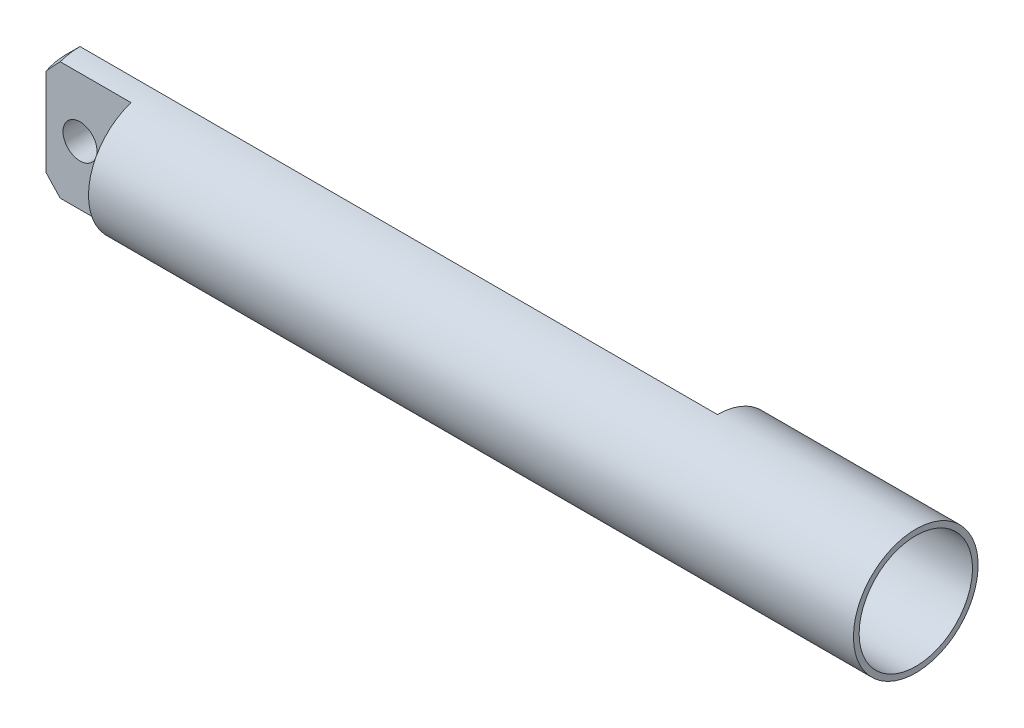
ISO-10303-21;
HEADER;
FILE_DESCRIPTION(('STEP AP214'),'2;1');
FILE_NAME('part.step','',(''),(''),'','','');
FILE_SCHEMA(('AUTOMOTIVE_DESIGN { 1 0 10303 214 1 1 1 1 }'));
ENDSEC;
DATA;
#1=APPLICATION_CONTEXT('core data for automotive mechanical design processes');
#2=APPLICATION_PROTOCOL_DEFINITION('international standard','automotive_design',2000,#1);
#3=PRODUCT_CONTEXT('',#1,'mechanical');
#4=PRODUCT('Part','Part','',(#3));
#5=PRODUCT_RELATED_PRODUCT_CATEGORY('part','',(#4));
#6=PRODUCT_DEFINITION_FORMATION('','',#4);
#7=PRODUCT_DEFINITION_CONTEXT('part definition',#1,'design');
#8=PRODUCT_DEFINITION('design','',#6,#7);
#9=PRODUCT_DEFINITION_SHAPE('','',#8);
#10=(LENGTH_UNIT() NAMED_UNIT(*) SI_UNIT(.MILLI.,.METRE.));
#11=(NAMED_UNIT(*) PLANE_ANGLE_UNIT() SI_UNIT($,.RADIAN.));
#12=(NAMED_UNIT(*) SI_UNIT($,.STERADIAN.) SOLID_ANGLE_UNIT());
#13=UNCERTAINTY_MEASURE_WITH_UNIT(LENGTH_MEASURE(1.E-05),#10,'distance_accuracy_value','');
#14=(GEOMETRIC_REPRESENTATION_CONTEXT(3) GLOBAL_UNCERTAINTY_ASSIGNED_CONTEXT((#13)) GLOBAL_UNIT_ASSIGNED_CONTEXT((#10,
#11,#12)) REPRESENTATION_CONTEXT('',''));
#15=CARTESIAN_POINT('',(0.,0.,0.));
#16=DIRECTION('',(0.,0.,1.));
#17=DIRECTION('',(1.,0.,0.));
#18=AXIS2_PLACEMENT_3D('',#15,#16,#17);
#19=CARTESIAN_POINT('',(0.,0.,0.));
#20=DIRECTION('',(1.,0.,0.));
#21=DIRECTION('',(0.,0.,-1.));
#22=AXIS2_PLACEMENT_3D('',#19,#20,#21);
#23=CONICAL_SURFACE('',#22,17.,0.785398163397446);
#24=CARTESIAN_POINT('',(5.00000000000003,0.,0.));
#25=DIRECTION('',(1.,0.,0.));
#26=DIRECTION('',(0.,0.,-1.));
#27=AXIS2_PLACEMENT_3D('',#24,#25,#26);
#28=CIRCLE('',#27,22.);
#29=CARTESIAN_POINT('',(5.00000000000003,22.,0.));
#30=VERTEX_POINT('',#29);
#31=CARTESIAN_POINT('',(5.00000000000003,20.8566536146142,7.));
#32=VERTEX_POINT('',#31);
#33=EDGE_CURVE('E218',#30,#32,#28,.T.);
#34=ORIENTED_EDGE('',*,*,#33,.F.);
#35=DIRECTION('',(0.707106781186549,0.707106781186546,0.));
#36=VECTOR('',#35,1.);
#37=CARTESIAN_POINT('',(-17.0000000000001,0.,0.));
#38=LINE('',#37,#36);
#39=CARTESIAN_POINT('',(0.,17.,0.));
#40=VERTEX_POINT('',#39);
#41=EDGE_CURVE('E175',#30,#40,#38,.F.);
#42=ORIENTED_EDGE('',*,*,#41,.T.);
#43=CARTESIAN_POINT('',(0.,0.,0.));
#44=DIRECTION('',(1.,0.,0.));
#45=DIRECTION('',(0.,0.,-1.));
#46=AXIS2_PLACEMENT_3D('',#43,#44,#45);
#47=CIRCLE('',#46,17.);
#48=CARTESIAN_POINT('',(0.,15.4919333848297,7.));
#49=VERTEX_POINT('',#48);
#50=EDGE_CURVE('E154',#49,#40,#47,.F.);
#51=ORIENTED_EDGE('',*,*,#50,.F.);
#52=CARTESIAN_POINT('',(31.5701077905815,48.0630353888379,7.));
#53=CARTESIAN_POINT('',(30.8650761382699,47.3505632230193,7.));
#54=CARTESIAN_POINT('',(30.1602065255339,46.6379306918936,7.));
#55=CARTESIAN_POINT('',(28.7508440464437,45.2122915091911,7.));
#56=CARTESIAN_POINT('',(28.0463511805407,44.4992848571683,7.));
#57=CARTESIAN_POINT('',(25.9328341762823,42.3589324364409,7.));
#58=CARTESIAN_POINT('',(24.5244575258011,40.9309471282378,7.));
#59=CARTESIAN_POINT('',(21.6970223543506,38.0594690326153,7.));
#60=CARTESIAN_POINT('',(20.2779854635847,36.6159549356621,7.));
#61=CARTESIAN_POINT('',(18.1522875392003,34.4485560927306,7.));
#62=CARTESIAN_POINT('',(17.444366089254,33.7259075862687,7.));
#63=CARTESIAN_POINT('',(16.0295523010908,32.2796199318595,7.));
#64=CARTESIAN_POINT('',(15.3226599512197,31.5559807953135,7.));
#65=CARTESIAN_POINT('',(13.6596415445129,29.8506444878507,7.));
#66=CARTESIAN_POINT('',(12.7040333637323,28.8684419762615,7.));
#67=CARTESIAN_POINT('',(10.7958232811266,26.9010256039762,7.));
#68=CARTESIAN_POINT('',(9.84322153031176,25.9158115967585,7.));
#69=CARTESIAN_POINT('',(7.94065271163517,23.9396758972288,7.));
#70=CARTESIAN_POINT('',(6.99069266344639,22.9487474361605,7.));
#71=CARTESIAN_POINT('',(5.57045220865292,21.4580484351075,7.));
#72=CARTESIAN_POINT('',(5.09786459650827,20.9604763244431,7.));
#73=CARTESIAN_POINT('',(4.15458893420663,19.9635354098252,7.));
#74=CARTESIAN_POINT('',(3.68390088073946,19.4641666090057,7.));
#75=CARTESIAN_POINT('',(2.74823564369237,18.4667925844649,7.));
#76=CARTESIAN_POINT('',(2.28324168477367,17.9688031096764,7.));
#77=CARTESIAN_POINT('',(1.35619003741677,16.9700981376442,7.));
#78=CARTESIAN_POINT('',(0.894132344076689,16.4693826449539,7.));
#79=CARTESIAN_POINT('',(-0.0265449003242374,15.4641209887141,7.));
#80=CARTESIAN_POINT('',(-0.485161691456694,14.9595722927023,7.));
#81=CARTESIAN_POINT('',(-1.16932139972602,14.1993848119594,7.));
#82=CARTESIAN_POINT('',(-1.39674089251136,13.9454352315961,7.));
#83=CARTESIAN_POINT('',(-1.85012285545061,13.436226320162,7.));
#84=CARTESIAN_POINT('',(-2.07608528145381,13.1809669498199,7.));
#85=CARTESIAN_POINT('',(-2.75006025917463,12.4145182758588,7.));
#86=CARTESIAN_POINT('',(-3.1955616171932,11.9011068563673,7.));
#87=CARTESIAN_POINT('',(-3.85670055654037,11.1249500019967,7.));
#88=CARTESIAN_POINT('',(-4.07589068401354,10.8652293067926,7.));
#89=CARTESIAN_POINT('',(-4.51140108065928,10.3433948789674,7.));
#90=CARTESIAN_POINT('',(-4.72772139027854,10.0812811801608,7.));
#91=CARTESIAN_POINT('',(-5.15663585066014,9.55450822884358,7.));
#92=CARTESIAN_POINT('',(-5.36923391735207,9.28985216967131,7.));
#93=CARTESIAN_POINT('',(-5.79015046559175,8.75713433134795,7.));
#94=CARTESIAN_POINT('',(-5.99846879309546,8.48907243016777,7.));
#95=CARTESIAN_POINT('',(-6.40966208162001,7.94895702349721,7.));
#96=CARTESIAN_POINT('',(-6.61253906199983,7.67690505841673,7.));
#97=CARTESIAN_POINT('',(-7.0114712487723,7.12785619638195,7.));
#98=CARTESIAN_POINT('',(-7.2075271968475,6.85085984204108,7.));
#99=CARTESIAN_POINT('',(-7.44964218217866,6.49709216248077,7.));
#100=CARTESIAN_POINT('',(-7.49981370126489,6.42312658187934,7.));
#101=CARTESIAN_POINT('',(-7.59949789401569,6.27474812910039,7.));
#102=CARTESIAN_POINT('',(-7.64901054010798,6.20033523839199,7.));
#103=CARTESIAN_POINT('',(-7.79649371009593,5.97638328025984,7.));
#104=CARTESIAN_POINT('',(-7.89340188161102,5.82614198033318,7.));
#105=CARTESIAN_POINT('',(-8.08395810085896,5.52355198936783,7.));
#106=CARTESIAN_POINT('',(-8.17760539709554,5.3712028237104,7.));
#107=CARTESIAN_POINT('',(-8.36106543411646,5.06421841160476,7.));
#108=CARTESIAN_POINT('',(-8.45087822101401,4.9095831926784,7.));
#109=CARTESIAN_POINT('',(-8.71225392812507,4.44436993971348,7.));
#110=CARTESIAN_POINT('',(-8.87729850653726,4.1300686287095,7.));
#111=CARTESIAN_POINT('',(-9.18332554692453,3.48988581256848,7.));
#112=CARTESIAN_POINT('',(-9.32431998495111,3.16401016926225,7.));
#113=CARTESIAN_POINT('',(-9.52601934968783,2.62615608190444,7.));
#114=CARTESIAN_POINT('',(-9.59686672285746,2.41799279992795,7.));
#115=CARTESIAN_POINT('',(-9.72345196152338,1.99709989936599,7.));
#116=CARTESIAN_POINT('',(-9.77919271681168,1.78437116253491,7.));
#117=CARTESIAN_POINT('',(-9.8729675183327,1.35577322277707,7.));
#118=CARTESIAN_POINT('',(-9.91106289065166,1.13991762688148,7.));
#119=CARTESIAN_POINT('',(-9.96781604509921,0.70563381251934,7.));
#120=CARTESIAN_POINT('',(-9.98647476535196,0.487205718730935,7.));
#121=CARTESIAN_POINT('',(-10.0032942419288,0.0481206090549654,7.));
#122=CARTESIAN_POINT('',(-10.0013206685666,-0.172541657224552,7.));
#123=CARTESIAN_POINT('',(-9.97667563599004,-0.612689287418194,7.));
#124=CARTESIAN_POINT('',(-9.95400376845756,-0.832174628029023,7.));
#125=CARTESIAN_POINT('',(-9.88922372520413,-1.2688271219645,7.));
#126=CARTESIAN_POINT('',(-9.84706253684897,-1.48598628888818,7.));
#127=CARTESIAN_POINT('',(-9.74547883615067,-1.91619890720227,7.));
#128=CARTESIAN_POINT('',(-9.68605315416654,-2.12925159700607,7.));
#129=CARTESIAN_POINT('',(-9.51128167766772,-2.68054257011638,7.));
#130=CARTESIAN_POINT('',(-9.38404477100819,-3.01500150331893,7.));
#131=CARTESIAN_POINT('',(-9.10108796968404,-3.67163491265435,7.));
#132=CARTESIAN_POINT('',(-8.94534323992436,-3.99379837931033,7.));
#133=CARTESIAN_POINT('',(-8.6958592968862,-4.46956269651672,7.));
#134=CARTESIAN_POINT('',(-8.60982101541379,-4.62728453460318,7.));
#135=CARTESIAN_POINT('',(-8.43326546216344,-4.94020814683483,7.));
#136=CARTESIAN_POINT('',(-8.34274813476996,-5.09540988965665,7.));
#137=CARTESIAN_POINT('',(-8.15794167106159,-5.40344039395045,7.));
#138=CARTESIAN_POINT('',(-8.06365437496583,-5.55627026382095,7.));
#139=CARTESIAN_POINT('',(-7.87180313392317,-5.85984533770355,7.));
#140=CARTESIAN_POINT('',(-7.77423932260608,-6.01059062638032,7.));
#141=CARTESIAN_POINT('',(-7.43851477249205,-6.51879212358237,7.));
#142=CARTESIAN_POINT('',(-7.19370875988075,-6.87186408827454,7.));
#143=CARTESIAN_POINT('',(-6.69259025979986,-7.56977595354441,7.));
#144=CARTESIAN_POINT('',(-6.43627517115237,-7.91461396590771,7.));
#145=CARTESIAN_POINT('',(-5.91497265284755,-8.59806209694107,7.));
#146=CARTESIAN_POINT('',(-5.64997882955784,-8.9366673234023,7.));
#147=CARTESIAN_POINT('',(-5.11360283988082,-9.60871314837262,7.));
#148=CARTESIAN_POINT('',(-4.8422212150803,-9.94215418077952,7.));
#149=CARTESIAN_POINT('',(-4.29383966381738,-10.6057281600215,7.));
#150=CARTESIAN_POINT('',(-4.0168277750113,-10.9358511994809,7.));
#151=CARTESIAN_POINT('',(-3.45887319379346,-11.5927625860197,7.));
#152=CARTESIAN_POINT('',(-3.17793043120126,-11.919550873381,7.));
#153=CARTESIAN_POINT('',(-2.61301938729385,-12.5702533767026,7.));
#154=CARTESIAN_POINT('',(-2.32905245082897,-12.8941687616829,7.));
#155=CARTESIAN_POINT('',(-1.75855432118312,-13.5397350102771,7.));
#156=CARTESIAN_POINT('',(-1.47202310906609,-13.8613858571369,7.));
#157=CARTESIAN_POINT('',(-0.607709955294125,-14.8252699109725,7.));
#158=CARTESIAN_POINT('',(-0.0267581145560945,-15.4646602646406,7.));
#159=CARTESIAN_POINT('',(1.14109612470462,-16.7380839327859,7.));
#160=CARTESIAN_POINT('',(1.72799911235955,-17.3721167052725,7.));
#161=CARTESIAN_POINT('',(2.90527627308781,-18.6352431982205,7.));
#162=CARTESIAN_POINT('',(3.49564423283112,-19.2643427148722,7.));
#163=CARTESIAN_POINT('',(4.67960046676606,-20.5194638586059,7.));
#164=CARTESIAN_POINT('',(5.27318864004685,-21.1454855809772,7.));
#165=CARTESIAN_POINT('',(6.39950269375031,-22.3285889800581,7.));
#166=CARTESIAN_POINT('',(6.93197638181449,-22.885910900628,7.));
#167=CARTESIAN_POINT('',(7.99854022023005,-23.9990062363673,7.));
#168=CARTESIAN_POINT('',(8.5326303720933,-24.5547796500874,7.));
#169=CARTESIAN_POINT('',(10.136882535791,-26.2202171075156,7.));
#170=CARTESIAN_POINT('',(11.2090131772108,-27.3279846610412,7.));
#171=CARTESIAN_POINT('',(13.3575190899308,-29.5406244420544,7.));
#172=CARTESIAN_POINT('',(14.433896440103,-30.6454946485879,7.));
#173=CARTESIAN_POINT('',(16.5892870464237,-32.852650133153,7.));
#174=CARTESIAN_POINT('',(17.6683002902857,-33.9549354231867,7.));
#175=CARTESIAN_POINT('',(19.8142771125641,-36.1432734152895,7.));
#176=CARTESIAN_POINT('',(20.8812152579,-37.2293510678509,7.));
#177=CARTESIAN_POINT('',(23.0165730701089,-39.4000520773872,7.));
#178=CARTESIAN_POINT('',(24.0849927393276,-40.4846754320543,7.));
#179=CARTESIAN_POINT('',(26.2223342961586,-42.6521118030097,7.));
#180=CARTESIAN_POINT('',(27.2912554709257,-43.7349255223925,7.));
#181=CARTESIAN_POINT('',(29.4300338889634,-45.8996233029592,7.));
#182=CARTESIAN_POINT('',(30.4998911301015,-46.9815073662501,7.));
#183=CARTESIAN_POINT('',(31.5701077905815,-48.063035388838,7.));
#184=B_SPLINE_CURVE_WITH_KNOTS('',3,(#52,#53,#54,#55,#56,#57,#58,#59,#60,#61,#62,#63,#64,#65,
#66,#67,#68,#69,#70,#71,#72,#73,#74,#75,#76,#77,#78,#79,#80,#81,#82,#83,#84,#85,#86,#87,#88,#89,
#90,#91,#92,#93,#94,#95,#96,#97,#98,#99,#100,#101,#102,#103,#104,#105,#106,#107,#108,#109,#110,
#111,#112,#113,#114,#115,#116,#117,#118,#119,#120,#121,#122,#123,#124,#125,#126,#127,#128,#129,
#130,#131,#132,#133,#134,#135,#136,#137,#138,#139,#140,#141,#142,#143,#144,#145,#146,#147,#148,
#149,#150,#151,#152,#153,#154,#155,#156,#157,#158,#159,#160,#161,#162,#163,#164,#165,#166,#167,
#168,#169,#170,#171,#172,#173,#174,#175,#176,#177,#178,#179,#180,#181,#182,#183),.UNSPECIFIED.,
.F.,.F.,(4,2,2,2,2,2,2,2,2,2,2,2,2,2,2,2,2,2,2,2,2,2,2,2,2,2,2,2,2,2,2,2,2,2,2,2,2,2,2,2,2,2,2,
2,2,2,2,2,2,2,2,2,2,2,2,2,2,2,2,2,2,2,2,2,2,4),(0.,3.00702108879685,6.01404577192607,
12.0310200924749,18.1036253005166,21.1384824197541,24.1733048989162,28.2844040383324,
32.3957064887369,36.5138486628209,38.5725467512036,40.6312412505342,42.6752269475995,
44.7192092314881,46.7646855376217,47.7873677956584,48.8100808978194,50.8492357746153,
51.8687753633788,52.8883005676398,53.9066795042937,54.9250950322714,55.9431272306233,
56.9610483854246,57.2291740040194,57.4973108079836,58.0336246251177,58.570061233115,
59.1064913881901,60.1707614932866,61.2345000754959,61.8937028842191,62.552779502833,
63.2095480048328,63.8662848059533,64.5273000408138,65.1883283158954,65.8511653221205,
66.5141240975964,67.5857046277632,68.6582231661447,69.1971535531769,69.7360906336943,
70.2747677820411,70.8134229875261,72.1019674855226,73.3908046892271,74.6806137394121,
75.9703138248588,77.2631216232246,78.5559525324529,79.848230718051,81.1405184544466,
83.7321606327217,86.3240619245699,88.9122319728333,91.5003213795792,93.8127239749873,
96.1251287338571,100.749995086049,105.377509509904,110.005002404787,114.572417353221,
119.139839541231,123.704453071571,128.269056229705),.UNSPECIFIED.);
#185=EDGE_CURVE('E276',#32,#49,#184,.T.);
#186=ORIENTED_EDGE('',*,*,#185,.F.);
#187=EDGE_LOOP('',(#34,#42,#51,#186));
#188=FACE_BOUND('',#187,.T.);
#189=ADVANCED_FACE('F39',(#188),#23,.T.);
#190=CARTESIAN_POINT('',(0.,0.,0.));
#191=DIRECTION('',(1.,0.,0.));
#192=DIRECTION('',(0.,0.,-1.));
#193=AXIS2_PLACEMENT_3D('',#190,#191,#192);
#194=PLANE('',#193);
#195=DIRECTION('',(0.,-1.,0.));
#196=VECTOR('',#195,1.);
#197=CARTESIAN_POINT('',(0.,28.1356099975247,0.));
#198=LINE('',#197,#196);
#199=CARTESIAN_POINT('',(0.,0.,0.));
#200=VERTEX_POINT('',#199);
#201=EDGE_CURVE('E134',#40,#200,#198,.T.);
#202=ORIENTED_EDGE('',*,*,#201,.T.);
#203=DIRECTION('',(0.,0.,-1.));
#204=VECTOR('',#203,1.);
#205=CARTESIAN_POINT('',(0.,0.,-39.2357516968204));
#206=LINE('',#205,#204);
#207=CARTESIAN_POINT('',(0.,0.,-7.));
#208=VERTEX_POINT('',#207);
#209=EDGE_CURVE('E142',#200,#208,#206,.T.);
#210=ORIENTED_EDGE('',*,*,#209,.T.);
#211=DIRECTION('',(0.,-1.,0.));
#212=VECTOR('',#211,1.);
#213=CARTESIAN_POINT('',(0.,0.,-7.));
#214=LINE('',#213,#212);
#215=CARTESIAN_POINT('',(0.,-15.4919333848297,-7.));
#216=VERTEX_POINT('',#215);
#217=EDGE_CURVE('E199',#208,#216,#214,.T.);
#218=ORIENTED_EDGE('',*,*,#217,.T.);
#219=CARTESIAN_POINT('',(0.,-15.4919333848297,7.));
#220=VERTEX_POINT('',#219);
#221=EDGE_CURVE('E214',#216,#220,#47,.F.);
#222=ORIENTED_EDGE('',*,*,#221,.T.);
#223=DIRECTION('',(0.,1.,0.));
#224=VECTOR('',#223,1.);
#225=CARTESIAN_POINT('',(0.,0.,7.));
#226=LINE('',#225,#224);
#227=EDGE_CURVE('E191',#220,#49,#226,.T.);
#228=ORIENTED_EDGE('',*,*,#227,.T.);
#229=ORIENTED_EDGE('',*,*,#50,.T.);
#230=EDGE_LOOP('',(#202,#210,#218,#222,#228,#229));
#231=FACE_BOUND('',#230,.T.);
#232=ADVANCED_FACE('F151',(#231),#194,.F.);
#233=CARTESIAN_POINT('',(0.,0.,0.));
#234=DIRECTION('',(-1.,0.,0.));
#235=DIRECTION('',(0.,0.,1.));
#236=AXIS2_PLACEMENT_3D('',#233,#234,#235);
#237=CYLINDRICAL_SURFACE('',#236,22.);
#238=CARTESIAN_POINT('',(300.,0.,0.));
#239=DIRECTION('',(-1.,0.,0.));
#240=DIRECTION('',(0.,0.,1.));
#241=AXIS2_PLACEMENT_3D('',#238,#239,#240);
#242=CIRCLE('',#241,22.);
#243=CARTESIAN_POINT('',(300.,0.,22.));
#244=VERTEX_POINT('',#243);
#245=EDGE_CURVE('E211',#244,#244,#242,.T.);
#246=ORIENTED_EDGE('',*,*,#245,.T.);
#247=EDGE_LOOP('',(#246));
#248=FACE_BOUND('',#247,.T.);
#249=DIRECTION('',(-1.,0.,0.));
#250=VECTOR('',#249,1.);
#251=CARTESIAN_POINT('',(0.,22.,0.));
#252=LINE('',#251,#250);
#253=CARTESIAN_POINT('',(230.,22.,0.));
#254=VERTEX_POINT('',#253);
#255=EDGE_CURVE('E173',#30,#254,#252,.F.);
#256=ORIENTED_EDGE('',*,*,#255,.F.);
#257=ORIENTED_EDGE('',*,*,#33,.T.);
#258=DIRECTION('',(-1.,0.,0.));
#259=VECTOR('',#258,1.);
#260=CARTESIAN_POINT('',(0.,20.8566536146142,7.));
#261=LINE('',#260,#259);
#262=CARTESIAN_POINT('',(30.,20.8566536146142,7.));
#263=VERTEX_POINT('',#262);
#264=EDGE_CURVE('E193',#32,#263,#261,.F.);
#265=ORIENTED_EDGE('',*,*,#264,.T.);
#266=CARTESIAN_POINT('',(30.,0.,0.));
#267=DIRECTION('',(1.,0.,0.));
#268=DIRECTION('',(0.,0.,-1.));
#269=AXIS2_PLACEMENT_3D('',#266,#267,#268);
#270=CIRCLE('',#269,22.);
#271=CARTESIAN_POINT('',(30.,-20.8566536146142,7.));
#272=VERTEX_POINT('',#271);
#273=EDGE_CURVE('E285',#263,#272,#270,.T.);
#274=ORIENTED_EDGE('',*,*,#273,.T.);
#275=DIRECTION('',(-1.,0.,0.));
#276=VECTOR('',#275,1.);
#277=CARTESIAN_POINT('',(0.,-20.8566536146142,7.));
#278=LINE('',#277,#276);
#279=CARTESIAN_POINT('',(5.00000000000003,-20.8566536146142,7.));
#280=VERTEX_POINT('',#279);
#281=EDGE_CURVE('E188',#272,#280,#278,.T.);
#282=ORIENTED_EDGE('',*,*,#281,.T.);
#283=CARTESIAN_POINT('',(5.00000000000003,-20.8566536146142,-7.));
#284=VERTEX_POINT('',#283);
#285=EDGE_CURVE('E217',#280,#284,#28,.T.);
#286=ORIENTED_EDGE('',*,*,#285,.T.);
#287=DIRECTION('',(-1.,0.,0.));
#288=VECTOR('',#287,1.);
#289=CARTESIAN_POINT('',(0.,-20.8566536146142,-7.));
#290=LINE('',#289,#288);
#291=CARTESIAN_POINT('',(30.,-20.8566536146142,-7.));
#292=VERTEX_POINT('',#291);
#293=EDGE_CURVE('E201',#284,#292,#290,.F.);
#294=ORIENTED_EDGE('',*,*,#293,.T.);
#295=CARTESIAN_POINT('',(30.,0.,0.));
#296=DIRECTION('',(1.,0.,0.));
#297=DIRECTION('',(0.,0.,-1.));
#298=AXIS2_PLACEMENT_3D('',#295,#296,#297);
#299=CIRCLE('',#298,22.);
#300=CARTESIAN_POINT('',(30.,0.,-22.));
#301=VERTEX_POINT('',#300);
#302=EDGE_CURVE('E227',#292,#301,#299,.T.);
#303=ORIENTED_EDGE('',*,*,#302,.T.);
#304=DIRECTION('',(-1.,0.,0.));
#305=VECTOR('',#304,1.);
#306=CARTESIAN_POINT('',(0.,0.,-22.));
#307=LINE('',#306,#305);
#308=CARTESIAN_POINT('',(230.,0.,-22.));
#309=VERTEX_POINT('',#308);
#310=EDGE_CURVE('E163',#309,#301,#307,.T.);
#311=ORIENTED_EDGE('',*,*,#310,.F.);
#312=CARTESIAN_POINT('',(230.,0.,0.));
#313=DIRECTION('',(-1.,0.,0.));
#314=DIRECTION('',(0.,0.,1.));
#315=AXIS2_PLACEMENT_3D('',#312,#313,#314);
#316=CIRCLE('',#315,22.);
#317=EDGE_CURVE('E177',#254,#309,#316,.T.);
#318=ORIENTED_EDGE('',*,*,#317,.F.);
#319=EDGE_LOOP('',(#256,#257,#265,#274,#282,#286,#294,#303,#311,#318));
#320=FACE_BOUND('',#319,.T.);
#321=ADVANCED_FACE('F245',(#248,#320),#237,.T.);
#322=CARTESIAN_POINT('',(0.,0.,0.));
#323=DIRECTION('',(-1.,0.,0.));
#324=DIRECTION('',(0.,0.,1.));
#325=AXIS2_PLACEMENT_3D('',#322,#323,#324);
#326=CYLINDRICAL_SURFACE('',#325,20.);
#327=CARTESIAN_POINT('',(300.,0.,0.));
#328=DIRECTION('',(-1.,0.,0.));
#329=DIRECTION('',(0.,0.,1.));
#330=AXIS2_PLACEMENT_3D('',#327,#328,#329);
#331=CIRCLE('',#330,20.);
#332=CARTESIAN_POINT('',(300.,0.,20.));
#333=VERTEX_POINT('',#332);
#334=EDGE_CURVE('E208',#333,#333,#331,.T.);
#335=ORIENTED_EDGE('',*,*,#334,.F.);
#336=EDGE_LOOP('',(#335));
#337=FACE_BOUND('',#336,.T.);
#338=DIRECTION('',(-1.,0.,0.));
#339=VECTOR('',#338,1.);
#340=CARTESIAN_POINT('',(0.,20.,0.));
#341=LINE('',#340,#339);
#342=CARTESIAN_POINT('',(230.,20.,0.));
#343=VERTEX_POINT('',#342);
#344=CARTESIAN_POINT('',(40.,20.,0.));
#345=VERTEX_POINT('',#344);
#346=EDGE_CURVE('E171',#343,#345,#341,.T.);
#347=ORIENTED_EDGE('',*,*,#346,.F.);
#348=CARTESIAN_POINT('',(230.,0.,0.));
#349=DIRECTION('',(-1.,0.,0.));
#350=DIRECTION('',(0.,0.,1.));
#351=AXIS2_PLACEMENT_3D('',#348,#349,#350);
#352=CIRCLE('',#351,20.);
#353=CARTESIAN_POINT('',(230.,0.,-20.));
#354=VERTEX_POINT('',#353);
#355=EDGE_CURVE('E12',#354,#343,#352,.F.);
#356=ORIENTED_EDGE('',*,*,#355,.F.);
#357=DIRECTION('',(-1.,0.,0.));
#358=VECTOR('',#357,1.);
#359=CARTESIAN_POINT('',(0.,0.,-20.));
#360=LINE('',#359,#358);
#361=CARTESIAN_POINT('',(40.,0.,-20.));
#362=VERTEX_POINT('',#361);
#363=EDGE_CURVE('E167',#362,#354,#360,.F.);
#364=ORIENTED_EDGE('',*,*,#363,.F.);
#365=CARTESIAN_POINT('',(40.,0.,0.));
#366=DIRECTION('',(-1.,0.,0.));
#367=DIRECTION('',(0.,0.,1.));
#368=AXIS2_PLACEMENT_3D('',#365,#366,#367);
#369=CIRCLE('',#368,20.);
#370=EDGE_CURVE('E204',#362,#345,#369,.T.);
#371=ORIENTED_EDGE('',*,*,#370,.T.);
#372=EDGE_LOOP('',(#347,#356,#364,#371));
#373=FACE_BOUND('',#372,.T.);
#374=ADVANCED_FACE('F241',(#337,#373),#326,.F.);
#375=CARTESIAN_POINT('',(40.,0.,-20.));
#376=DIRECTION('',(-1.,0.,0.));
#377=DIRECTION('',(0.,0.,1.));
#378=AXIS2_PLACEMENT_3D('',#375,#376,#377);
#379=PLANE('',#378);
#380=DIRECTION('',(0.,-1.,0.));
#381=VECTOR('',#380,1.);
#382=CARTESIAN_POINT('',(40.,0.,0.));
#383=LINE('',#382,#381);
#384=CARTESIAN_POINT('',(40.,0.,0.));
#385=VERTEX_POINT('',#384);
#386=EDGE_CURVE('E169',#345,#385,#383,.T.);
#387=ORIENTED_EDGE('',*,*,#386,.F.);
#388=ORIENTED_EDGE('',*,*,#370,.F.);
#389=DIRECTION('',(0.,0.,-1.));
#390=VECTOR('',#389,1.);
#391=CARTESIAN_POINT('',(40.,0.,-20.));
#392=LINE('',#391,#390);
#393=EDGE_CURVE('E165',#385,#362,#392,.T.);
#394=ORIENTED_EDGE('',*,*,#393,.F.);
#395=EDGE_LOOP('',(#387,#388,#394));
#396=FACE_BOUND('',#395,.T.);
#397=ADVANCED_FACE('F238',(#396),#379,.F.);
#398=CARTESIAN_POINT('',(30.,-25.,-7.));
#399=DIRECTION('',(1.,0.,0.));
#400=DIRECTION('',(0.,0.,-1.));
#401=AXIS2_PLACEMENT_3D('',#398,#399,#400);
#402=PLANE('',#401);
#403=DIRECTION('',(0.,0.,1.));
#404=VECTOR('',#403,1.);
#405=CARTESIAN_POINT('',(30.,0.,-7.));
#406=LINE('',#405,#404);
#407=CARTESIAN_POINT('',(30.,0.,-7.));
#408=VERTEX_POINT('',#407);
#409=EDGE_CURVE('E161',#301,#408,#406,.T.);
#410=ORIENTED_EDGE('',*,*,#409,.F.);
#411=ORIENTED_EDGE('',*,*,#302,.F.);
#412=DIRECTION('',(0.,1.,0.));
#413=VECTOR('',#412,1.);
#414=CARTESIAN_POINT('',(30.,-25.,-7.));
#415=LINE('',#414,#413);
#416=EDGE_CURVE('E196',#292,#408,#415,.T.);
#417=ORIENTED_EDGE('',*,*,#416,.T.);
#418=EDGE_LOOP('',(#410,#411,#417));
#419=FACE_BOUND('',#418,.T.);
#420=ADVANCED_FACE('F235',(#419),#402,.F.);
#421=CARTESIAN_POINT('',(-32.3054599446581,-25.,-7.));
#422=DIRECTION('',(0.,0.,1.));
#423=DIRECTION('',(1.,0.,0.));
#424=AXIS2_PLACEMENT_3D('',#421,#422,#423);
#425=PLANE('',#424);
#426=DIRECTION('',(-1.,0.,0.));
#427=VECTOR('',#426,1.);
#428=CARTESIAN_POINT('',(-32.3054599446581,0.,-7.));
#429=LINE('',#428,#427);
#430=CARTESIAN_POINT('',(18.,0.,-7.));
#431=VERTEX_POINT('',#430);
#432=EDGE_CURVE('E160',#408,#431,#429,.T.);
#433=ORIENTED_EDGE('',*,*,#432,.F.);
#434=ORIENTED_EDGE('',*,*,#416,.F.);
#435=ORIENTED_EDGE('',*,*,#293,.F.);
#436=CARTESIAN_POINT('',(31.5701077905815,-48.0630353888379,-7.));
#437=CARTESIAN_POINT('',(30.8650761382699,-47.3505632230193,-7.));
#438=CARTESIAN_POINT('',(30.1602065255339,-46.6379306918936,-7.));
#439=CARTESIAN_POINT('',(28.7508440464437,-45.2122915091911,-7.));
#440=CARTESIAN_POINT('',(28.0463511805407,-44.4992848571683,-7.));
#441=CARTESIAN_POINT('',(25.9328341762823,-42.3589324364409,-7.));
#442=CARTESIAN_POINT('',(24.5244575258011,-40.9309471282378,-7.));
#443=CARTESIAN_POINT('',(21.6970223543506,-38.0594690326153,-7.));
#444=CARTESIAN_POINT('',(20.2779854635847,-36.6159549356621,-7.));
#445=CARTESIAN_POINT('',(18.1522875392003,-34.4485560927306,-7.));
#446=CARTESIAN_POINT('',(17.444366089254,-33.7259075862687,-7.));
#447=CARTESIAN_POINT('',(16.0295523010908,-32.2796199318595,-7.));
#448=CARTESIAN_POINT('',(15.3226599512197,-31.5559807953135,-7.));
#449=CARTESIAN_POINT('',(13.6596415445129,-29.8506444878507,-7.));
#450=CARTESIAN_POINT('',(12.7040333637323,-28.8684419762615,-7.));
#451=CARTESIAN_POINT('',(10.7958232811266,-26.9010256039762,-7.));
#452=CARTESIAN_POINT('',(9.84322153031176,-25.9158115967585,-7.));
#453=CARTESIAN_POINT('',(7.94065271163517,-23.9396758972288,-7.));
#454=CARTESIAN_POINT('',(6.99069266344639,-22.9487474361605,-7.));
#455=CARTESIAN_POINT('',(5.57045220865292,-21.4580484351075,-7.));
#456=CARTESIAN_POINT('',(5.09786459650827,-20.9604763244431,-7.));
#457=CARTESIAN_POINT('',(4.15458893420663,-19.9635354098252,-7.));
#458=CARTESIAN_POINT('',(3.68390088073946,-19.4641666090057,-7.));
#459=CARTESIAN_POINT('',(2.74823564369237,-18.4667925844649,-7.));
#460=CARTESIAN_POINT('',(2.28324168477367,-17.9688031096764,-7.));
#461=CARTESIAN_POINT('',(1.35619003741677,-16.9700981376442,-7.));
#462=CARTESIAN_POINT('',(0.894132344076689,-16.4693826449539,-7.));
#463=CARTESIAN_POINT('',(-0.0265449003242374,-15.4641209887141,-7.));
#464=CARTESIAN_POINT('',(-0.485161691456694,-14.9595722927023,-7.));
#465=CARTESIAN_POINT('',(-1.16932139972602,-14.1993848119594,-7.));
#466=CARTESIAN_POINT('',(-1.39674089251136,-13.9454352315961,-7.));
#467=CARTESIAN_POINT('',(-1.85012285545061,-13.436226320162,-7.));
#468=CARTESIAN_POINT('',(-2.07608528145381,-13.1809669498199,-7.));
#469=CARTESIAN_POINT('',(-2.75006025917463,-12.4145182758588,-7.));
#470=CARTESIAN_POINT('',(-3.1955616171932,-11.9011068563673,-7.));
#471=CARTESIAN_POINT('',(-3.85670055654037,-11.1249500019967,-7.));
#472=CARTESIAN_POINT('',(-4.07589068401354,-10.8652293067926,-7.));
#473=CARTESIAN_POINT('',(-4.51140108065928,-10.3433948789674,-7.));
#474=CARTESIAN_POINT('',(-4.72772139027854,-10.0812811801608,-7.));
#475=CARTESIAN_POINT('',(-5.15663585066014,-9.55450822884358,-7.));
#476=CARTESIAN_POINT('',(-5.36923391735207,-9.28985216967131,-7.));
#477=CARTESIAN_POINT('',(-5.79015046559175,-8.75713433134795,-7.));
#478=CARTESIAN_POINT('',(-5.99846879309546,-8.48907243016777,-7.));
#479=CARTESIAN_POINT('',(-6.40966208162001,-7.94895702349721,-7.));
#480=CARTESIAN_POINT('',(-6.61253906199983,-7.67690505841673,-7.));
#481=CARTESIAN_POINT('',(-7.0114712487723,-7.12785619638195,-7.));
#482=CARTESIAN_POINT('',(-7.2075271968475,-6.85085984204108,-7.));
#483=CARTESIAN_POINT('',(-7.44964218217866,-6.49709216248077,-7.));
#484=CARTESIAN_POINT('',(-7.49981370126489,-6.42312658187934,-7.));
#485=CARTESIAN_POINT('',(-7.59949789401569,-6.27474812910039,-7.));
#486=CARTESIAN_POINT('',(-7.64901054010798,-6.20033523839199,-7.));
#487=CARTESIAN_POINT('',(-7.79649371009593,-5.97638328025984,-7.));
#488=CARTESIAN_POINT('',(-7.89340188161102,-5.82614198033318,-7.));
#489=CARTESIAN_POINT('',(-8.08395810085896,-5.52355198936783,-7.));
#490=CARTESIAN_POINT('',(-8.17760539709554,-5.3712028237104,-7.));
#491=CARTESIAN_POINT('',(-8.36106543411646,-5.06421841160476,-7.));
#492=CARTESIAN_POINT('',(-8.45087822101401,-4.9095831926784,-7.));
#493=CARTESIAN_POINT('',(-8.71225392812507,-4.44436993971348,-7.));
#494=CARTESIAN_POINT('',(-8.87729850653726,-4.1300686287095,-7.));
#495=CARTESIAN_POINT('',(-9.18332554692453,-3.48988581256848,-7.));
#496=CARTESIAN_POINT('',(-9.32431998495111,-3.16401016926225,-7.));
#497=CARTESIAN_POINT('',(-9.52601934968783,-2.62615608190444,-7.));
#498=CARTESIAN_POINT('',(-9.59686672285746,-2.41799279992795,-7.));
#499=CARTESIAN_POINT('',(-9.72345196152338,-1.99709989936599,-7.));
#500=CARTESIAN_POINT('',(-9.77919271681168,-1.78437116253491,-7.));
#501=CARTESIAN_POINT('',(-9.8729675183327,-1.35577322277707,-7.));
#502=CARTESIAN_POINT('',(-9.91106289065166,-1.13991762688148,-7.));
#503=CARTESIAN_POINT('',(-9.96781604509921,-0.70563381251934,-7.));
#504=CARTESIAN_POINT('',(-9.98647476535196,-0.487205718730935,-7.));
#505=CARTESIAN_POINT('',(-10.0032942419288,-0.0481206090549654,-7.));
#506=CARTESIAN_POINT('',(-10.0013206685666,0.172541657224552,-7.));
#507=CARTESIAN_POINT('',(-9.97667563599004,0.612689287418194,-7.));
#508=CARTESIAN_POINT('',(-9.95400376845756,0.832174628029023,-7.));
#509=CARTESIAN_POINT('',(-9.88922372520413,1.2688271219645,-7.));
#510=CARTESIAN_POINT('',(-9.84706253684897,1.48598628888818,-7.));
#511=CARTESIAN_POINT('',(-9.74547883615067,1.91619890720227,-7.));
#512=CARTESIAN_POINT('',(-9.68605315416654,2.12925159700607,-7.));
#513=CARTESIAN_POINT('',(-9.51128167766772,2.68054257011638,-7.));
#514=CARTESIAN_POINT('',(-9.38404477100819,3.01500150331893,-7.));
#515=CARTESIAN_POINT('',(-9.10108796968404,3.67163491265435,-7.));
#516=CARTESIAN_POINT('',(-8.94534323992436,3.99379837931033,-7.));
#517=CARTESIAN_POINT('',(-8.6958592968862,4.46956269651672,-7.));
#518=CARTESIAN_POINT('',(-8.60982101541379,4.62728453460318,-7.));
#519=CARTESIAN_POINT('',(-8.43326546216344,4.94020814683483,-7.));
#520=CARTESIAN_POINT('',(-8.34274813476996,5.09540988965665,-7.));
#521=CARTESIAN_POINT('',(-8.15794167106159,5.40344039395045,-7.));
#522=CARTESIAN_POINT('',(-8.06365437496583,5.55627026382095,-7.));
#523=CARTESIAN_POINT('',(-7.87180313392317,5.85984533770355,-7.));
#524=CARTESIAN_POINT('',(-7.77423932260608,6.01059062638032,-7.));
#525=CARTESIAN_POINT('',(-7.43851477249205,6.51879212358237,-7.));
#526=CARTESIAN_POINT('',(-7.19370875988075,6.87186408827454,-7.));
#527=CARTESIAN_POINT('',(-6.69259025979986,7.56977595354441,-7.));
#528=CARTESIAN_POINT('',(-6.43627517115237,7.91461396590771,-7.));
#529=CARTESIAN_POINT('',(-5.91497265284755,8.59806209694107,-7.));
#530=CARTESIAN_POINT('',(-5.64997882955784,8.9366673234023,-7.));
#531=CARTESIAN_POINT('',(-5.11360283988082,9.60871314837262,-7.));
#532=CARTESIAN_POINT('',(-4.8422212150803,9.94215418077952,-7.));
#533=CARTESIAN_POINT('',(-4.29383966381738,10.6057281600215,-7.));
#534=CARTESIAN_POINT('',(-4.0168277750113,10.9358511994809,-7.));
#535=CARTESIAN_POINT('',(-3.45887319379346,11.5927625860197,-7.));
#536=CARTESIAN_POINT('',(-3.17793043120126,11.919550873381,-7.));
#537=CARTESIAN_POINT('',(-2.61301938729385,12.5702533767026,-7.));
#538=CARTESIAN_POINT('',(-2.32905245082897,12.8941687616829,-7.));
#539=CARTESIAN_POINT('',(-1.75855432118312,13.5397350102771,-7.));
#540=CARTESIAN_POINT('',(-1.47202310906609,13.8613858571369,-7.));
#541=CARTESIAN_POINT('',(-0.607709955294125,14.8252699109725,-7.));
#542=CARTESIAN_POINT('',(-0.0267581145560945,15.4646602646406,-7.));
#543=CARTESIAN_POINT('',(1.14109612470462,16.7380839327859,-7.));
#544=CARTESIAN_POINT('',(1.72799911235955,17.3721167052725,-7.));
#545=CARTESIAN_POINT('',(2.90527627308781,18.6352431982205,-7.));
#546=CARTESIAN_POINT('',(3.49564423283112,19.2643427148722,-7.));
#547=CARTESIAN_POINT('',(4.67960046676606,20.5194638586059,-7.));
#548=CARTESIAN_POINT('',(5.27318864004685,21.1454855809772,-7.));
#549=CARTESIAN_POINT('',(6.39950269375031,22.3285889800581,-7.));
#550=CARTESIAN_POINT('',(6.93197638181449,22.885910900628,-7.));
#551=CARTESIAN_POINT('',(7.99854022023005,23.9990062363673,-7.));
#552=CARTESIAN_POINT('',(8.5326303720933,24.5547796500874,-7.));
#553=CARTESIAN_POINT('',(10.136882535791,26.2202171075156,-7.));
#554=CARTESIAN_POINT('',(11.2090131772108,27.3279846610412,-7.));
#555=CARTESIAN_POINT('',(13.3575190899308,29.5406244420544,-7.));
#556=CARTESIAN_POINT('',(14.433896440103,30.6454946485879,-7.));
#557=CARTESIAN_POINT('',(16.5892870464237,32.852650133153,-7.));
#558=CARTESIAN_POINT('',(17.6683002902857,33.9549354231867,-7.));
#559=CARTESIAN_POINT('',(19.8142771125641,36.1432734152895,-7.));
#560=CARTESIAN_POINT('',(20.8812152579,37.2293510678509,-7.));
#561=CARTESIAN_POINT('',(23.0165730701089,39.4000520773872,-7.));
#562=CARTESIAN_POINT('',(24.0849927393276,40.4846754320543,-7.));
#563=CARTESIAN_POINT('',(26.2223342961586,42.6521118030097,-7.));
#564=CARTESIAN_POINT('',(27.2912554709257,43.7349255223925,-7.));
#565=CARTESIAN_POINT('',(29.4300338889634,45.8996233029592,-7.));
#566=CARTESIAN_POINT('',(30.4998911301015,46.9815073662501,-7.));
#567=CARTESIAN_POINT('',(31.5701077905815,48.063035388838,-7.));
#568=B_SPLINE_CURVE_WITH_KNOTS('',3,(#436,#437,#438,#439,#440,#441,#442,#443,#444,#445,#446,
#447,#448,#449,#450,#451,#452,#453,#454,#455,#456,#457,#458,#459,#460,#461,#462,#463,#464,#465,
#466,#467,#468,#469,#470,#471,#472,#473,#474,#475,#476,#477,#478,#479,#480,#481,#482,#483,#484,
#485,#486,#487,#488,#489,#490,#491,#492,#493,#494,#495,#496,#497,#498,#499,#500,#501,#502,#503,
#504,#505,#506,#507,#508,#509,#510,#511,#512,#513,#514,#515,#516,#517,#518,#519,#520,#521,#522,
#523,#524,#525,#526,#527,#528,#529,#530,#531,#532,#533,#534,#535,#536,#537,#538,#539,#540,#541,
#542,#543,#544,#545,#546,#547,#548,#549,#550,#551,#552,#553,#554,#555,#556,#557,#558,#559,#560,
#561,#562,#563,#564,#565,#566,#567),.UNSPECIFIED.,.F.,.F.,(4,2,2,2,2,2,2,2,2,2,2,2,2,2,2,2,2,2,
2,2,2,2,2,2,2,2,2,2,2,2,2,2,2,2,2,2,2,2,2,2,2,2,2,2,2,2,2,2,2,2,2,2,2,2,2,2,2,2,2,2,2,2,2,2,2,
4),(0.,3.00702108879685,6.01404577192607,12.0310200924749,18.1036253005166,21.1384824197541,
24.1733048989162,28.2844040383324,32.3957064887369,36.5138486628209,38.5725467512036,
40.6312412505342,42.6752269475995,44.7192092314881,46.7646855376217,47.7873677956584,
48.8100808978194,50.8492357746153,51.8687753633788,52.8883005676398,53.9066795042937,
54.9250950322714,55.9431272306233,56.9610483854246,57.2291740040194,57.4973108079836,
58.0336246251177,58.570061233115,59.1064913881901,60.1707614932866,61.2345000754959,
61.8937028842191,62.552779502833,63.2095480048328,63.8662848059533,64.5273000408138,
65.1883283158954,65.8511653221205,66.5141240975964,67.5857046277632,68.6582231661447,
69.1971535531769,69.7360906336943,70.2747677820411,70.8134229875261,72.1019674855226,
73.3908046892271,74.6806137394121,75.9703138248588,77.2631216232246,78.5559525324529,
79.848230718051,81.1405184544466,83.7321606327217,86.3240619245699,88.9122319728333,
91.5003213795792,93.8127239749873,96.1251287338571,100.749995086049,105.377509509904,
110.005002404787,114.572417353221,119.139839541231,123.704453071571,128.269056229705),.UNSPECIFIED.);
#569=EDGE_CURVE('E220',#284,#216,#568,.T.);
#570=ORIENTED_EDGE('',*,*,#569,.T.);
#571=ORIENTED_EDGE('',*,*,#217,.F.);
#572=CARTESIAN_POINT('',(6.,0.,-7.));
#573=VERTEX_POINT('',#572);
#574=EDGE_CURVE('E145',#573,#208,#429,.T.);
#575=ORIENTED_EDGE('',*,*,#574,.F.);
#576=CARTESIAN_POINT('',(12.,0.,-7.));
#577=DIRECTION('',(0.,0.,-1.));
#578=DIRECTION('',(-1.,0.,0.));
#579=AXIS2_PLACEMENT_3D('',#576,#577,#578);
#580=CIRCLE('',#579,6.);
#581=EDGE_CURVE('E179',#431,#573,#580,.T.);
#582=ORIENTED_EDGE('',*,*,#581,.F.);
#583=EDGE_LOOP('',(#433,#434,#435,#570,#571,#575,#582));
#584=FACE_BOUND('',#583,.T.);
#585=ADVANCED_FACE('F229',(#584),#425,.F.);
#586=CARTESIAN_POINT('',(12.,0.,22.001));
#587=DIRECTION('',(0.,0.,-1.));
#588=DIRECTION('',(-1.,0.,0.));
#589=AXIS2_PLACEMENT_3D('',#586,#587,#588);
#590=CYLINDRICAL_SURFACE('',#589,6.);
#591=CARTESIAN_POINT('',(12.,0.,7.));
#592=DIRECTION('',(0.,0.,-1.));
#593=DIRECTION('',(-1.,0.,0.));
#594=AXIS2_PLACEMENT_3D('',#591,#592,#593);
#595=CIRCLE('',#594,6.);
#596=CARTESIAN_POINT('',(6.,0.,7.));
#597=VERTEX_POINT('',#596);
#598=EDGE_CURVE('E182',#597,#597,#595,.F.);
#599=ORIENTED_EDGE('',*,*,#598,.T.);
#600=EDGE_LOOP('',(#599));
#601=FACE_BOUND('',#600,.T.);
#602=DIRECTION('',(0.,0.,-1.));
#603=VECTOR('',#602,1.);
#604=CARTESIAN_POINT('',(18.,0.,22.001));
#605=LINE('',#604,#603);
#606=CARTESIAN_POINT('',(18.,0.,0.));
#607=VERTEX_POINT('',#606);
#608=EDGE_CURVE('E48',#431,#607,#605,.F.);
#609=ORIENTED_EDGE('',*,*,#608,.F.);
#610=ORIENTED_EDGE('',*,*,#581,.T.);
#611=DIRECTION('',(0.,0.,-1.));
#612=VECTOR('',#611,1.);
#613=CARTESIAN_POINT('',(6.,0.,22.001));
#614=LINE('',#613,#612);
#615=CARTESIAN_POINT('',(6.,0.,0.));
#616=VERTEX_POINT('',#615);
#617=EDGE_CURVE('E288',#616,#573,#614,.T.);
#618=ORIENTED_EDGE('',*,*,#617,.F.);
#619=CARTESIAN_POINT('',(12.,0.,0.));
#620=DIRECTION('',(0.,0.,-1.));
#621=DIRECTION('',(-1.,0.,0.));
#622=AXIS2_PLACEMENT_3D('',#619,#620,#621);
#623=CIRCLE('',#622,6.);
#624=EDGE_CURVE('E137',#607,#616,#623,.F.);
#625=ORIENTED_EDGE('',*,*,#624,.F.);
#626=EDGE_LOOP('',(#609,#610,#618,#625));
#627=FACE_BOUND('',#626,.T.);
#628=ADVANCED_FACE('F234',(#601,#627),#590,.F.);
#629=CARTESIAN_POINT('',(300.,0.,-22.));
#630=DIRECTION('',(-1.,0.,0.));
#631=DIRECTION('',(0.,0.,1.));
#632=AXIS2_PLACEMENT_3D('',#629,#630,#631);
#633=PLANE('',#632);
#634=ORIENTED_EDGE('',*,*,#245,.F.);
#635=EDGE_LOOP('',(#634));
#636=FACE_BOUND('',#635,.T.);
#637=ORIENTED_EDGE('',*,*,#334,.T.);
#638=EDGE_LOOP('',(#637));
#639=FACE_BOUND('',#638,.T.);
#640=ADVANCED_FACE('F247',(#636,#639),#633,.F.);
#641=EDGE_CURVE('E273',#220,#280,#184,.T.);
#642=ORIENTED_EDGE('',*,*,#641,.F.);
#643=ORIENTED_EDGE('',*,*,#221,.F.);
#644=ORIENTED_EDGE('',*,*,#569,.F.);
#645=ORIENTED_EDGE('',*,*,#285,.F.);
#646=EDGE_LOOP('',(#642,#643,#644,#645));
#647=FACE_BOUND('',#646,.T.);
#648=ADVANCED_FACE('F41',(#647),#23,.T.);
#649=CARTESIAN_POINT('',(30.,-25.,7.));
#650=DIRECTION('',(1.,0.,0.));
#651=DIRECTION('',(0.,0.,-1.));
#652=AXIS2_PLACEMENT_3D('',#649,#650,#651);
#653=PLANE('',#652);
#654=DIRECTION('',(0.,1.,0.));
#655=VECTOR('',#654,1.);
#656=CARTESIAN_POINT('',(30.,-25.,7.));
#657=LINE('',#656,#655);
#658=EDGE_CURVE('E185',#272,#263,#657,.T.);
#659=ORIENTED_EDGE('',*,*,#658,.F.);
#660=ORIENTED_EDGE('',*,*,#273,.F.);
#661=EDGE_LOOP('',(#659,#660));
#662=FACE_BOUND('',#661,.T.);
#663=ADVANCED_FACE('F262',(#662),#653,.F.);
#664=CARTESIAN_POINT('',(-32.3054599446581,-25.,7.));
#665=DIRECTION('',(0.,0.,-1.));
#666=DIRECTION('',(-1.,0.,0.));
#667=AXIS2_PLACEMENT_3D('',#664,#665,#666);
#668=PLANE('',#667);
#669=ORIENTED_EDGE('',*,*,#598,.F.);
#670=EDGE_LOOP('',(#669));
#671=FACE_BOUND('',#670,.T.);
#672=ORIENTED_EDGE('',*,*,#185,.T.);
#673=ORIENTED_EDGE('',*,*,#227,.F.);
#674=ORIENTED_EDGE('',*,*,#641,.T.);
#675=ORIENTED_EDGE('',*,*,#281,.F.);
#676=ORIENTED_EDGE('',*,*,#658,.T.);
#677=ORIENTED_EDGE('',*,*,#264,.F.);
#678=EDGE_LOOP('',(#672,#673,#674,#675,#676,#677));
#679=FACE_BOUND('',#678,.T.);
#680=ADVANCED_FACE('F267',(#671,#679),#668,.F.);
#681=CARTESIAN_POINT('',(230.,0.,-39.2357516968204));
#682=DIRECTION('',(-1.,0.,0.));
#683=DIRECTION('',(0.,0.,1.));
#684=AXIS2_PLACEMENT_3D('',#681,#682,#683);
#685=PLANE('',#684);
#686=ORIENTED_EDGE('',*,*,#317,.T.);
#687=DIRECTION('',(0.,0.,-1.));
#688=VECTOR('',#687,1.);
#689=CARTESIAN_POINT('',(230.,0.,-39.2357516968204));
#690=LINE('',#689,#688);
#691=EDGE_CURVE('E139',#354,#309,#690,.T.);
#692=ORIENTED_EDGE('',*,*,#691,.F.);
#693=ORIENTED_EDGE('',*,*,#355,.T.);
#694=DIRECTION('',(0.,-1.,0.));
#695=VECTOR('',#694,1.);
#696=CARTESIAN_POINT('',(230.,28.1356099975247,0.));
#697=LINE('',#696,#695);
#698=EDGE_CURVE('E148',#254,#343,#697,.T.);
#699=ORIENTED_EDGE('',*,*,#698,.F.);
#700=EDGE_LOOP('',(#686,#692,#693,#699));
#701=FACE_BOUND('',#700,.T.);
#702=ADVANCED_FACE('F308',(#701),#685,.T.);
#703=CARTESIAN_POINT('',(230.,28.1356099975247,0.));
#704=DIRECTION('',(0.,0.,-1.));
#705=DIRECTION('',(-1.,0.,0.));
#706=AXIS2_PLACEMENT_3D('',#703,#704,#705);
#707=PLANE('',#706);
#708=ORIENTED_EDGE('',*,*,#255,.T.);
#709=ORIENTED_EDGE('',*,*,#698,.T.);
#710=ORIENTED_EDGE('',*,*,#346,.T.);
#711=ORIENTED_EDGE('',*,*,#386,.T.);
#712=DIRECTION('',(-1.,0.,0.));
#713=VECTOR('',#712,1.);
#714=CARTESIAN_POINT('',(230.,0.,0.));
#715=LINE('',#714,#713);
#716=EDGE_CURVE('E55',#385,#607,#715,.T.);
#717=ORIENTED_EDGE('',*,*,#716,.T.);
#718=ORIENTED_EDGE('',*,*,#624,.T.);
#719=EDGE_CURVE('E63',#616,#200,#715,.T.);
#720=ORIENTED_EDGE('',*,*,#719,.T.);
#721=ORIENTED_EDGE('',*,*,#201,.F.);
#722=ORIENTED_EDGE('',*,*,#41,.F.);
#723=EDGE_LOOP('',(#708,#709,#710,#711,#717,#718,#720,#721,#722));
#724=FACE_BOUND('',#723,.T.);
#725=ADVANCED_FACE('F132',(#724),#707,.T.);
#726=CARTESIAN_POINT('',(230.,0.,-39.2357516968204));
#727=DIRECTION('',(0.,1.,0.));
#728=DIRECTION('',(0.,0.,1.));
#729=AXIS2_PLACEMENT_3D('',#726,#727,#728);
#730=PLANE('',#729);
#731=ORIENTED_EDGE('',*,*,#363,.T.);
#732=ORIENTED_EDGE('',*,*,#691,.T.);
#733=ORIENTED_EDGE('',*,*,#310,.T.);
#734=ORIENTED_EDGE('',*,*,#409,.T.);
#735=ORIENTED_EDGE('',*,*,#432,.T.);
#736=ORIENTED_EDGE('',*,*,#608,.T.);
#737=ORIENTED_EDGE('',*,*,#716,.F.);
#738=ORIENTED_EDGE('',*,*,#393,.T.);
#739=EDGE_LOOP('',(#731,#732,#733,#734,#735,#736,#737,#738));
#740=FACE_BOUND('',#739,.T.);
#741=ADVANCED_FACE('F296',(#740),#730,.T.);
#742=ORIENTED_EDGE('',*,*,#574,.T.);
#743=ORIENTED_EDGE('',*,*,#209,.F.);
#744=ORIENTED_EDGE('',*,*,#719,.F.);
#745=ORIENTED_EDGE('',*,*,#617,.T.);
#746=EDGE_LOOP('',(#742,#743,#744,#745));
#747=FACE_BOUND('',#746,.T.);
#748=ADVANCED_FACE('F143',(#747),#730,.T.);
#749=CLOSED_SHELL('',(#189,#232,#321,#374,#397,#420,#585,#628,#640,#648,#663,#680,#702,#725,
#741,#748));
#750=MANIFOLD_SOLID_BREP('B2',#749);
#751=ADVANCED_BREP_SHAPE_REPRESENTATION('',(#18,#750),#14);
#752=SHAPE_DEFINITION_REPRESENTATION(#9,#751);
ENDSEC;
END-ISO-10303-21;
